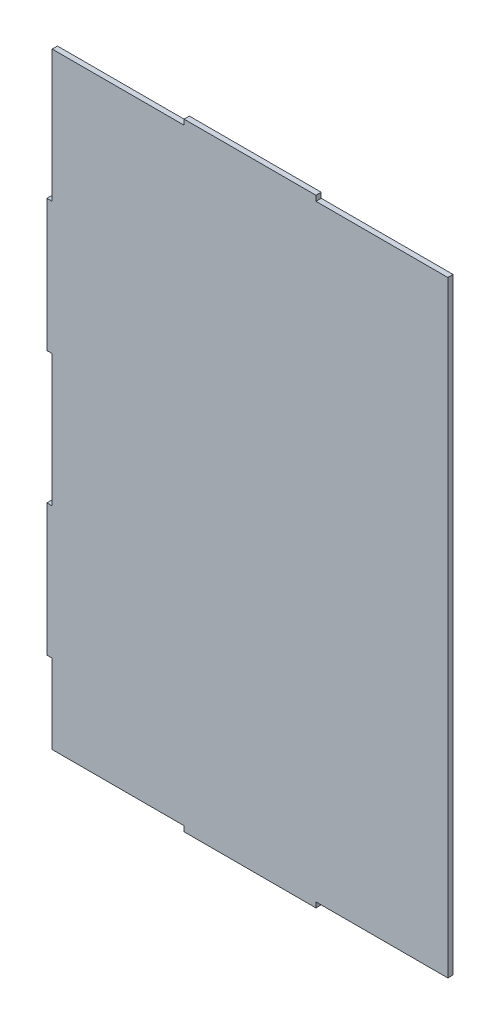
ISO-10303-21;
HEADER;
FILE_DESCRIPTION(('STEP AP214'),'2;1');
FILE_NAME('part.step','',(''),(''),'','','');
FILE_SCHEMA(('AUTOMOTIVE_DESIGN { 1 0 10303 214 1 1 1 1 }'));
ENDSEC;
DATA;
#1=APPLICATION_CONTEXT('core data for automotive mechanical design processes');
#2=APPLICATION_PROTOCOL_DEFINITION('international standard','automotive_design',2000,#1);
#3=PRODUCT_CONTEXT('',#1,'mechanical');
#4=PRODUCT('Part','Part','',(#3));
#5=PRODUCT_RELATED_PRODUCT_CATEGORY('part','',(#4));
#6=PRODUCT_DEFINITION_FORMATION('','',#4);
#7=PRODUCT_DEFINITION_CONTEXT('part definition',#1,'design');
#8=PRODUCT_DEFINITION('design','',#6,#7);
#9=PRODUCT_DEFINITION_SHAPE('','',#8);
#10=(LENGTH_UNIT() NAMED_UNIT(*) SI_UNIT(.MILLI.,.METRE.));
#11=(NAMED_UNIT(*) PLANE_ANGLE_UNIT() SI_UNIT($,.RADIAN.));
#12=(NAMED_UNIT(*) SI_UNIT($,.STERADIAN.) SOLID_ANGLE_UNIT());
#13=UNCERTAINTY_MEASURE_WITH_UNIT(LENGTH_MEASURE(1.E-05),#10,'distance_accuracy_value','');
#14=(GEOMETRIC_REPRESENTATION_CONTEXT(3) GLOBAL_UNCERTAINTY_ASSIGNED_CONTEXT((#13)) GLOBAL_UNIT_ASSIGNED_CONTEXT((#10,
#11,#12)) REPRESENTATION_CONTEXT('',''));
#15=CARTESIAN_POINT('',(0.,0.,0.));
#16=DIRECTION('',(0.,0.,1.));
#17=DIRECTION('',(1.,0.,0.));
#18=AXIS2_PLACEMENT_3D('',#15,#16,#17);
#19=CARTESIAN_POINT('',(-151.999999999999,-70.,4.));
#20=DIRECTION('',(1.,0.,0.));
#21=DIRECTION('',(0.,0.,-1.));
#22=AXIS2_PLACEMENT_3D('',#19,#20,#21);
#23=PLANE('',#22);
#24=DIRECTION('',(0.,-1.,0.));
#25=VECTOR('',#24,1.);
#26=CARTESIAN_POINT('',(-151.999999999999,-70.,0.));
#27=LINE('',#26,#25);
#28=CARTESIAN_POINT('',(-151.999999999999,-70.,0.));
#29=VERTEX_POINT('',#28);
#30=CARTESIAN_POINT('',(-151.999999999999,-170.,0.));
#31=VERTEX_POINT('',#30);
#32=EDGE_CURVE('E203',#29,#31,#27,.T.);
#33=ORIENTED_EDGE('',*,*,#32,.T.);
#34=DIRECTION('',(0.,0.,-1.));
#35=VECTOR('',#34,1.);
#36=CARTESIAN_POINT('',(-151.999999999999,-170.,4.));
#37=LINE('',#36,#35);
#38=CARTESIAN_POINT('',(-151.999999999999,-170.,4.));
#39=VERTEX_POINT('',#38);
#40=EDGE_CURVE('E11',#39,#31,#37,.T.);
#41=ORIENTED_EDGE('',*,*,#40,.F.);
#42=DIRECTION('',(0.,-1.,0.));
#43=VECTOR('',#42,1.);
#44=CARTESIAN_POINT('',(-151.999999999999,-70.,4.));
#45=LINE('',#44,#43);
#46=CARTESIAN_POINT('',(-151.999999999999,-70.,4.));
#47=VERTEX_POINT('',#46);
#48=EDGE_CURVE('E242',#47,#39,#45,.T.);
#49=ORIENTED_EDGE('',*,*,#48,.F.);
#50=DIRECTION('',(0.,0.,-1.));
#51=VECTOR('',#50,1.);
#52=CARTESIAN_POINT('',(-151.999999999999,-70.,4.));
#53=LINE('',#52,#51);
#54=EDGE_CURVE('E199',#47,#29,#53,.T.);
#55=ORIENTED_EDGE('',*,*,#54,.T.);
#56=EDGE_LOOP('',(#33,#41,#49,#55));
#57=FACE_BOUND('',#56,.T.);
#58=ADVANCED_FACE('F35',(#57),#23,.F.);
#59=CARTESIAN_POINT('',(-151.999999999999,-170.,4.));
#60=DIRECTION('',(0.,1.,0.));
#61=DIRECTION('',(0.,0.,1.));
#62=AXIS2_PLACEMENT_3D('',#59,#60,#61);
#63=PLANE('',#62);
#64=DIRECTION('',(1.,0.,0.));
#65=VECTOR('',#64,1.);
#66=CARTESIAN_POINT('',(-151.999999999999,-170.,0.));
#67=LINE('',#66,#65);
#68=CARTESIAN_POINT('',(-147.999999999999,-170.,0.));
#69=VERTEX_POINT('',#68);
#70=EDGE_CURVE('E206',#31,#69,#67,.T.);
#71=ORIENTED_EDGE('',*,*,#70,.T.);
#72=DIRECTION('',(0.,0.,-1.));
#73=VECTOR('',#72,1.);
#74=CARTESIAN_POINT('',(-147.999999999999,-170.,4.));
#75=LINE('',#74,#73);
#76=CARTESIAN_POINT('',(-147.999999999999,-170.,4.));
#77=VERTEX_POINT('',#76);
#78=EDGE_CURVE('E43',#77,#69,#75,.T.);
#79=ORIENTED_EDGE('',*,*,#78,.F.);
#80=DIRECTION('',(1.,0.,0.));
#81=VECTOR('',#80,1.);
#82=CARTESIAN_POINT('',(-151.999999999999,-170.,4.));
#83=LINE('',#82,#81);
#84=EDGE_CURVE('E130',#39,#77,#83,.T.);
#85=ORIENTED_EDGE('',*,*,#84,.F.);
#86=ORIENTED_EDGE('',*,*,#40,.T.);
#87=EDGE_LOOP('',(#71,#79,#85,#86));
#88=FACE_BOUND('',#87,.T.);
#89=ADVANCED_FACE('F360',(#88),#63,.F.);
#90=CARTESIAN_POINT('',(-147.999999999999,-170.,4.));
#91=DIRECTION('',(1.,0.,0.));
#92=DIRECTION('',(0.,1.,0.));
#93=AXIS2_PLACEMENT_3D('',#90,#91,#92);
#94=PLANE('',#93);
#95=DIRECTION('',(0.,-1.,0.));
#96=VECTOR('',#95,1.);
#97=CARTESIAN_POINT('',(-147.999999999999,-170.,0.));
#98=LINE('',#97,#96);
#99=CARTESIAN_POINT('',(-148.000000000001,-230.,0.));
#100=VERTEX_POINT('',#99);
#101=EDGE_CURVE('E208',#69,#100,#98,.T.);
#102=ORIENTED_EDGE('',*,*,#101,.T.);
#103=DIRECTION('',(0.,0.,-1.));
#104=VECTOR('',#103,1.);
#105=CARTESIAN_POINT('',(-148.000000000001,-230.,4.));
#106=LINE('',#105,#104);
#107=CARTESIAN_POINT('',(-148.000000000001,-230.,4.));
#108=VERTEX_POINT('',#107);
#109=EDGE_CURVE('E285',#108,#100,#106,.T.);
#110=ORIENTED_EDGE('',*,*,#109,.F.);
#111=DIRECTION('',(0.,-1.,0.));
#112=VECTOR('',#111,1.);
#113=CARTESIAN_POINT('',(-147.999999999999,-170.,4.));
#114=LINE('',#113,#112);
#115=EDGE_CURVE('E293',#77,#108,#114,.T.);
#116=ORIENTED_EDGE('',*,*,#115,.F.);
#117=ORIENTED_EDGE('',*,*,#78,.T.);
#118=EDGE_LOOP('',(#102,#110,#116,#117));
#119=FACE_BOUND('',#118,.T.);
#120=ADVANCED_FACE('F291',(#119),#94,.F.);
#121=CARTESIAN_POINT('',(-148.000000000001,-230.,4.));
#122=DIRECTION('',(0.,1.,0.));
#123=DIRECTION('',(0.,0.,1.));
#124=AXIS2_PLACEMENT_3D('',#121,#122,#123);
#125=PLANE('',#124);
#126=DIRECTION('',(1.,0.,0.));
#127=VECTOR('',#126,1.);
#128=CARTESIAN_POINT('',(-148.000000000001,-230.,0.));
#129=LINE('',#128,#127);
#130=CARTESIAN_POINT('',(-48.0000000000007,-230.,0.));
#131=VERTEX_POINT('',#130);
#132=EDGE_CURVE('E210',#100,#131,#129,.T.);
#133=ORIENTED_EDGE('',*,*,#132,.T.);
#134=DIRECTION('',(0.,0.,-1.));
#135=VECTOR('',#134,1.);
#136=CARTESIAN_POINT('',(-48.0000000000007,-230.,4.));
#137=LINE('',#136,#135);
#138=CARTESIAN_POINT('',(-48.0000000000007,-230.,4.));
#139=VERTEX_POINT('',#138);
#140=EDGE_CURVE('E282',#139,#131,#137,.T.);
#141=ORIENTED_EDGE('',*,*,#140,.F.);
#142=DIRECTION('',(1.,0.,0.));
#143=VECTOR('',#142,1.);
#144=CARTESIAN_POINT('',(-148.000000000001,-230.,4.));
#145=LINE('',#144,#143);
#146=EDGE_CURVE('E311',#108,#139,#145,.T.);
#147=ORIENTED_EDGE('',*,*,#146,.F.);
#148=ORIENTED_EDGE('',*,*,#109,.T.);
#149=EDGE_LOOP('',(#133,#141,#147,#148));
#150=FACE_BOUND('',#149,.T.);
#151=ADVANCED_FACE('F302',(#150),#125,.F.);
#152=CARTESIAN_POINT('',(-48.0000000000007,-230.,4.));
#153=DIRECTION('',(1.,0.,0.));
#154=DIRECTION('',(0.,0.,-1.));
#155=AXIS2_PLACEMENT_3D('',#152,#153,#154);
#156=PLANE('',#155);
#157=DIRECTION('',(0.,-1.,0.));
#158=VECTOR('',#157,1.);
#159=CARTESIAN_POINT('',(-48.0000000000007,-230.,0.));
#160=LINE('',#159,#158);
#161=CARTESIAN_POINT('',(-48.0000000000007,-234.,0.));
#162=VERTEX_POINT('',#161);
#163=EDGE_CURVE('E212',#131,#162,#160,.T.);
#164=ORIENTED_EDGE('',*,*,#163,.T.);
#165=DIRECTION('',(0.,0.,-1.));
#166=VECTOR('',#165,1.);
#167=CARTESIAN_POINT('',(-48.0000000000007,-234.,4.));
#168=LINE('',#167,#166);
#169=CARTESIAN_POINT('',(-48.0000000000007,-234.,4.));
#170=VERTEX_POINT('',#169);
#171=EDGE_CURVE('E279',#170,#162,#168,.T.);
#172=ORIENTED_EDGE('',*,*,#171,.F.);
#173=DIRECTION('',(0.,-1.,0.));
#174=VECTOR('',#173,1.);
#175=CARTESIAN_POINT('',(-48.0000000000007,-230.,4.));
#176=LINE('',#175,#174);
#177=EDGE_CURVE('E308',#139,#170,#176,.T.);
#178=ORIENTED_EDGE('',*,*,#177,.F.);
#179=ORIENTED_EDGE('',*,*,#140,.T.);
#180=EDGE_LOOP('',(#164,#172,#178,#179));
#181=FACE_BOUND('',#180,.T.);
#182=ADVANCED_FACE('F306',(#181),#156,.F.);
#183=CARTESIAN_POINT('',(-48.0000000000007,-234.,4.));
#184=DIRECTION('',(0.,1.,0.));
#185=DIRECTION('',(0.,0.,1.));
#186=AXIS2_PLACEMENT_3D('',#183,#184,#185);
#187=PLANE('',#186);
#188=DIRECTION('',(1.,0.,0.));
#189=VECTOR('',#188,1.);
#190=CARTESIAN_POINT('',(-48.0000000000007,-234.,0.));
#191=LINE('',#190,#189);
#192=CARTESIAN_POINT('',(51.9999999999993,-234.,0.));
#193=VERTEX_POINT('',#192);
#194=EDGE_CURVE('E214',#162,#193,#191,.T.);
#195=ORIENTED_EDGE('',*,*,#194,.T.);
#196=DIRECTION('',(0.,0.,-1.));
#197=VECTOR('',#196,1.);
#198=CARTESIAN_POINT('',(51.9999999999993,-234.,4.));
#199=LINE('',#198,#197);
#200=CARTESIAN_POINT('',(51.9999999999993,-234.,4.));
#201=VERTEX_POINT('',#200);
#202=EDGE_CURVE('E276',#201,#193,#199,.T.);
#203=ORIENTED_EDGE('',*,*,#202,.F.);
#204=DIRECTION('',(1.,0.,0.));
#205=VECTOR('',#204,1.);
#206=CARTESIAN_POINT('',(-48.0000000000007,-234.,4.));
#207=LINE('',#206,#205);
#208=EDGE_CURVE('E310',#170,#201,#207,.T.);
#209=ORIENTED_EDGE('',*,*,#208,.F.);
#210=ORIENTED_EDGE('',*,*,#171,.T.);
#211=EDGE_LOOP('',(#195,#203,#209,#210));
#212=FACE_BOUND('',#211,.T.);
#213=ADVANCED_FACE('F373',(#212),#187,.F.);
#214=CARTESIAN_POINT('',(51.9999999999993,-234.,4.));
#215=DIRECTION('',(-1.,0.,0.));
#216=DIRECTION('',(0.,0.,1.));
#217=AXIS2_PLACEMENT_3D('',#214,#215,#216);
#218=PLANE('',#217);
#219=DIRECTION('',(0.,1.,0.));
#220=VECTOR('',#219,1.);
#221=CARTESIAN_POINT('',(51.9999999999993,-234.,0.));
#222=LINE('',#221,#220);
#223=CARTESIAN_POINT('',(51.9999999999993,-230.,0.));
#224=VERTEX_POINT('',#223);
#225=EDGE_CURVE('E216',#193,#224,#222,.T.);
#226=ORIENTED_EDGE('',*,*,#225,.T.);
#227=DIRECTION('',(0.,0.,-1.));
#228=VECTOR('',#227,1.);
#229=CARTESIAN_POINT('',(51.9999999999993,-230.,4.));
#230=LINE('',#229,#228);
#231=CARTESIAN_POINT('',(51.9999999999993,-230.,4.));
#232=VERTEX_POINT('',#231);
#233=EDGE_CURVE('E273',#232,#224,#230,.T.);
#234=ORIENTED_EDGE('',*,*,#233,.F.);
#235=DIRECTION('',(0.,1.,0.));
#236=VECTOR('',#235,1.);
#237=CARTESIAN_POINT('',(51.9999999999993,-234.,4.));
#238=LINE('',#237,#236);
#239=EDGE_CURVE('E313',#201,#232,#238,.T.);
#240=ORIENTED_EDGE('',*,*,#239,.F.);
#241=ORIENTED_EDGE('',*,*,#202,.T.);
#242=EDGE_LOOP('',(#226,#234,#240,#241));
#243=FACE_BOUND('',#242,.T.);
#244=ADVANCED_FACE('F376',(#243),#218,.F.);
#245=CARTESIAN_POINT('',(51.9999999999993,-230.,4.));
#246=DIRECTION('',(0.,1.,0.));
#247=DIRECTION('',(0.,0.,1.));
#248=AXIS2_PLACEMENT_3D('',#245,#246,#247);
#249=PLANE('',#248);
#250=DIRECTION('',(1.,0.,0.));
#251=VECTOR('',#250,1.);
#252=CARTESIAN_POINT('',(51.9999999999993,-230.,0.));
#253=LINE('',#252,#251);
#254=CARTESIAN_POINT('',(151.999999999999,-230.,0.));
#255=VERTEX_POINT('',#254);
#256=EDGE_CURVE('E218',#224,#255,#253,.T.);
#257=ORIENTED_EDGE('',*,*,#256,.T.);
#258=DIRECTION('',(0.,0.,-1.));
#259=VECTOR('',#258,1.);
#260=CARTESIAN_POINT('',(151.999999999999,-230.,4.));
#261=LINE('',#260,#259);
#262=CARTESIAN_POINT('',(151.999999999999,-230.,4.));
#263=VERTEX_POINT('',#262);
#264=EDGE_CURVE('E270',#263,#255,#261,.T.);
#265=ORIENTED_EDGE('',*,*,#264,.F.);
#266=DIRECTION('',(1.,0.,0.));
#267=VECTOR('',#266,1.);
#268=CARTESIAN_POINT('',(51.9999999999993,-230.,4.));
#269=LINE('',#268,#267);
#270=EDGE_CURVE('E319',#232,#263,#269,.T.);
#271=ORIENTED_EDGE('',*,*,#270,.F.);
#272=ORIENTED_EDGE('',*,*,#233,.T.);
#273=EDGE_LOOP('',(#257,#265,#271,#272));
#274=FACE_BOUND('',#273,.T.);
#275=ADVANCED_FACE('F380',(#274),#249,.F.);
#276=CARTESIAN_POINT('',(151.999999999999,130.,4.));
#277=DIRECTION('',(-1.,0.,0.));
#278=DIRECTION('',(0.,0.,1.));
#279=AXIS2_PLACEMENT_3D('',#276,#277,#278);
#280=PLANE('',#279);
#281=DIRECTION('',(0.,1.,0.));
#282=VECTOR('',#281,1.);
#283=CARTESIAN_POINT('',(151.999999999999,130.,0.));
#284=LINE('',#283,#282);
#285=CARTESIAN_POINT('',(151.999999999999,230.,0.));
#286=VERTEX_POINT('',#285);
#287=EDGE_CURVE('E221',#255,#286,#284,.T.);
#288=ORIENTED_EDGE('',*,*,#287,.T.);
#289=DIRECTION('',(0.,0.,-1.));
#290=VECTOR('',#289,1.);
#291=CARTESIAN_POINT('',(151.999999999999,230.,4.));
#292=LINE('',#291,#290);
#293=CARTESIAN_POINT('',(151.999999999999,230.,4.));
#294=VERTEX_POINT('',#293);
#295=EDGE_CURVE('E267',#294,#286,#292,.T.);
#296=ORIENTED_EDGE('',*,*,#295,.F.);
#297=DIRECTION('',(0.,1.,0.));
#298=VECTOR('',#297,1.);
#299=CARTESIAN_POINT('',(151.999999999999,-230.,4.));
#300=LINE('',#299,#298);
#301=EDGE_CURVE('E321',#263,#294,#300,.T.);
#302=ORIENTED_EDGE('',*,*,#301,.F.);
#303=ORIENTED_EDGE('',*,*,#264,.T.);
#304=EDGE_LOOP('',(#288,#296,#302,#303));
#305=FACE_BOUND('',#304,.T.);
#306=ADVANCED_FACE('F384',(#305),#280,.F.);
#307=CARTESIAN_POINT('',(151.999999999999,230.,4.));
#308=DIRECTION('',(0.,-1.,0.));
#309=DIRECTION('',(0.,0.,-1.));
#310=AXIS2_PLACEMENT_3D('',#307,#308,#309);
#311=PLANE('',#310);
#312=DIRECTION('',(-1.,0.,0.));
#313=VECTOR('',#312,1.);
#314=CARTESIAN_POINT('',(151.999999999999,230.,0.));
#315=LINE('',#314,#313);
#316=CARTESIAN_POINT('',(51.9999999999993,230.,0.));
#317=VERTEX_POINT('',#316);
#318=EDGE_CURVE('E223',#286,#317,#315,.T.);
#319=ORIENTED_EDGE('',*,*,#318,.T.);
#320=DIRECTION('',(0.,0.,-1.));
#321=VECTOR('',#320,1.);
#322=CARTESIAN_POINT('',(51.9999999999993,230.,4.));
#323=LINE('',#322,#321);
#324=CARTESIAN_POINT('',(51.9999999999993,230.,4.));
#325=VERTEX_POINT('',#324);
#326=EDGE_CURVE('E264',#325,#317,#323,.T.);
#327=ORIENTED_EDGE('',*,*,#326,.F.);
#328=DIRECTION('',(-1.,0.,0.));
#329=VECTOR('',#328,1.);
#330=CARTESIAN_POINT('',(151.999999999999,230.,4.));
#331=LINE('',#330,#329);
#332=EDGE_CURVE('E323',#294,#325,#331,.T.);
#333=ORIENTED_EDGE('',*,*,#332,.F.);
#334=ORIENTED_EDGE('',*,*,#295,.T.);
#335=EDGE_LOOP('',(#319,#327,#333,#334));
#336=FACE_BOUND('',#335,.T.);
#337=ADVANCED_FACE('F388',(#336),#311,.F.);
#338=CARTESIAN_POINT('',(51.9999999999993,234.,4.));
#339=DIRECTION('',(-1.,0.,0.));
#340=DIRECTION('',(0.,0.,1.));
#341=AXIS2_PLACEMENT_3D('',#338,#339,#340);
#342=PLANE('',#341);
#343=DIRECTION('',(0.,1.,0.));
#344=VECTOR('',#343,1.);
#345=CARTESIAN_POINT('',(51.9999999999993,234.,0.));
#346=LINE('',#345,#344);
#347=CARTESIAN_POINT('',(51.9999999999993,234.,0.));
#348=VERTEX_POINT('',#347);
#349=EDGE_CURVE('E225',#317,#348,#346,.T.);
#350=ORIENTED_EDGE('',*,*,#349,.T.);
#351=DIRECTION('',(0.,0.,-1.));
#352=VECTOR('',#351,1.);
#353=CARTESIAN_POINT('',(51.9999999999993,234.,4.));
#354=LINE('',#353,#352);
#355=CARTESIAN_POINT('',(51.9999999999993,234.,4.));
#356=VERTEX_POINT('',#355);
#357=EDGE_CURVE('E261',#356,#348,#354,.T.);
#358=ORIENTED_EDGE('',*,*,#357,.F.);
#359=DIRECTION('',(0.,1.,0.));
#360=VECTOR('',#359,1.);
#361=CARTESIAN_POINT('',(51.9999999999993,234.,4.));
#362=LINE('',#361,#360);
#363=EDGE_CURVE('E325',#325,#356,#362,.T.);
#364=ORIENTED_EDGE('',*,*,#363,.F.);
#365=ORIENTED_EDGE('',*,*,#326,.T.);
#366=EDGE_LOOP('',(#350,#358,#364,#365));
#367=FACE_BOUND('',#366,.T.);
#368=ADVANCED_FACE('F392',(#367),#342,.F.);
#369=CARTESIAN_POINT('',(-48.0000000000007,234.,4.));
#370=DIRECTION('',(0.,-1.,0.));
#371=DIRECTION('',(0.,0.,-1.));
#372=AXIS2_PLACEMENT_3D('',#369,#370,#371);
#373=PLANE('',#372);
#374=DIRECTION('',(-1.,0.,0.));
#375=VECTOR('',#374,1.);
#376=CARTESIAN_POINT('',(-48.0000000000007,234.,0.));
#377=LINE('',#376,#375);
#378=CARTESIAN_POINT('',(-48.0000000000007,234.,0.));
#379=VERTEX_POINT('',#378);
#380=EDGE_CURVE('E227',#348,#379,#377,.T.);
#381=ORIENTED_EDGE('',*,*,#380,.T.);
#382=DIRECTION('',(0.,0.,-1.));
#383=VECTOR('',#382,1.);
#384=CARTESIAN_POINT('',(-48.0000000000007,234.,4.));
#385=LINE('',#384,#383);
#386=CARTESIAN_POINT('',(-48.0000000000007,234.,4.));
#387=VERTEX_POINT('',#386);
#388=EDGE_CURVE('E258',#387,#379,#385,.T.);
#389=ORIENTED_EDGE('',*,*,#388,.F.);
#390=DIRECTION('',(-1.,0.,0.));
#391=VECTOR('',#390,1.);
#392=CARTESIAN_POINT('',(-48.0000000000007,234.,4.));
#393=LINE('',#392,#391);
#394=EDGE_CURVE('E327',#356,#387,#393,.T.);
#395=ORIENTED_EDGE('',*,*,#394,.F.);
#396=ORIENTED_EDGE('',*,*,#357,.T.);
#397=EDGE_LOOP('',(#381,#389,#395,#396));
#398=FACE_BOUND('',#397,.T.);
#399=ADVANCED_FACE('F396',(#398),#373,.F.);
#400=CARTESIAN_POINT('',(-48.0000000000007,230.,4.));
#401=DIRECTION('',(1.,0.,0.));
#402=DIRECTION('',(0.,0.,-1.));
#403=AXIS2_PLACEMENT_3D('',#400,#401,#402);
#404=PLANE('',#403);
#405=DIRECTION('',(0.,-1.,0.));
#406=VECTOR('',#405,1.);
#407=CARTESIAN_POINT('',(-48.0000000000007,230.,0.));
#408=LINE('',#407,#406);
#409=CARTESIAN_POINT('',(-48.0000000000007,230.,0.));
#410=VERTEX_POINT('',#409);
#411=EDGE_CURVE('E229',#379,#410,#408,.T.);
#412=ORIENTED_EDGE('',*,*,#411,.T.);
#413=DIRECTION('',(0.,0.,-1.));
#414=VECTOR('',#413,1.);
#415=CARTESIAN_POINT('',(-48.0000000000007,230.,4.));
#416=LINE('',#415,#414);
#417=CARTESIAN_POINT('',(-48.0000000000007,230.,4.));
#418=VERTEX_POINT('',#417);
#419=EDGE_CURVE('E255',#418,#410,#416,.T.);
#420=ORIENTED_EDGE('',*,*,#419,.F.);
#421=DIRECTION('',(0.,-1.,0.));
#422=VECTOR('',#421,1.);
#423=CARTESIAN_POINT('',(-48.0000000000007,230.,4.));
#424=LINE('',#423,#422);
#425=EDGE_CURVE('E329',#387,#418,#424,.T.);
#426=ORIENTED_EDGE('',*,*,#425,.F.);
#427=ORIENTED_EDGE('',*,*,#388,.T.);
#428=EDGE_LOOP('',(#412,#420,#426,#427));
#429=FACE_BOUND('',#428,.T.);
#430=ADVANCED_FACE('F400',(#429),#404,.F.);
#431=CARTESIAN_POINT('',(-48.0000000000007,230.,4.));
#432=DIRECTION('',(0.,-1.,0.));
#433=DIRECTION('',(0.,0.,-1.));
#434=AXIS2_PLACEMENT_3D('',#431,#432,#433);
#435=PLANE('',#434);
#436=DIRECTION('',(-1.,0.,0.));
#437=VECTOR('',#436,1.);
#438=CARTESIAN_POINT('',(-48.0000000000007,230.,0.));
#439=LINE('',#438,#437);
#440=CARTESIAN_POINT('',(-148.000000000001,230.,0.));
#441=VERTEX_POINT('',#440);
#442=EDGE_CURVE('E231',#410,#441,#439,.T.);
#443=ORIENTED_EDGE('',*,*,#442,.T.);
#444=DIRECTION('',(0.,0.,-1.));
#445=VECTOR('',#444,1.);
#446=CARTESIAN_POINT('',(-148.000000000001,230.,4.));
#447=LINE('',#446,#445);
#448=CARTESIAN_POINT('',(-148.000000000001,230.,4.));
#449=VERTEX_POINT('',#448);
#450=EDGE_CURVE('E252',#449,#441,#447,.T.);
#451=ORIENTED_EDGE('',*,*,#450,.F.);
#452=DIRECTION('',(-1.,0.,0.));
#453=VECTOR('',#452,1.);
#454=CARTESIAN_POINT('',(-48.0000000000007,230.,4.));
#455=LINE('',#454,#453);
#456=EDGE_CURVE('E331',#418,#449,#455,.T.);
#457=ORIENTED_EDGE('',*,*,#456,.F.);
#458=ORIENTED_EDGE('',*,*,#419,.T.);
#459=EDGE_LOOP('',(#443,#451,#457,#458));
#460=FACE_BOUND('',#459,.T.);
#461=ADVANCED_FACE('F404',(#460),#435,.F.);
#462=CARTESIAN_POINT('',(-148.000000000001,230.,4.));
#463=DIRECTION('',(1.,0.,0.));
#464=DIRECTION('',(0.,1.,0.));
#465=AXIS2_PLACEMENT_3D('',#462,#463,#464);
#466=PLANE('',#465);
#467=DIRECTION('',(0.,-1.,0.));
#468=VECTOR('',#467,1.);
#469=CARTESIAN_POINT('',(-148.000000000001,230.,0.));
#470=LINE('',#469,#468);
#471=CARTESIAN_POINT('',(-148.,130.,0.));
#472=VERTEX_POINT('',#471);
#473=EDGE_CURVE('E233',#441,#472,#470,.T.);
#474=ORIENTED_EDGE('',*,*,#473,.T.);
#475=DIRECTION('',(0.,0.,-1.));
#476=VECTOR('',#475,1.);
#477=CARTESIAN_POINT('',(-148.,130.,4.));
#478=LINE('',#477,#476);
#479=CARTESIAN_POINT('',(-148.,130.,4.));
#480=VERTEX_POINT('',#479);
#481=EDGE_CURVE('E249',#480,#472,#478,.T.);
#482=ORIENTED_EDGE('',*,*,#481,.F.);
#483=DIRECTION('',(0.,-1.,0.));
#484=VECTOR('',#483,1.);
#485=CARTESIAN_POINT('',(-148.000000000001,230.,4.));
#486=LINE('',#485,#484);
#487=EDGE_CURVE('E333',#449,#480,#486,.T.);
#488=ORIENTED_EDGE('',*,*,#487,.F.);
#489=ORIENTED_EDGE('',*,*,#450,.T.);
#490=EDGE_LOOP('',(#474,#482,#488,#489));
#491=FACE_BOUND('',#490,.T.);
#492=ADVANCED_FACE('F408',(#491),#466,.F.);
#493=CARTESIAN_POINT('',(-148.,130.,4.));
#494=DIRECTION('',(0.,-1.,0.));
#495=DIRECTION('',(0.,0.,-1.));
#496=AXIS2_PLACEMENT_3D('',#493,#494,#495);
#497=PLANE('',#496);
#498=DIRECTION('',(-1.,0.,0.));
#499=VECTOR('',#498,1.);
#500=CARTESIAN_POINT('',(-148.,130.,0.));
#501=LINE('',#500,#499);
#502=CARTESIAN_POINT('',(-152.,130.,0.));
#503=VERTEX_POINT('',#502);
#504=EDGE_CURVE('E235',#472,#503,#501,.T.);
#505=ORIENTED_EDGE('',*,*,#504,.T.);
#506=DIRECTION('',(0.,0.,-1.));
#507=VECTOR('',#506,1.);
#508=CARTESIAN_POINT('',(-152.,130.,4.));
#509=LINE('',#508,#507);
#510=CARTESIAN_POINT('',(-152.,130.,4.));
#511=VERTEX_POINT('',#510);
#512=EDGE_CURVE('E246',#511,#503,#509,.T.);
#513=ORIENTED_EDGE('',*,*,#512,.F.);
#514=DIRECTION('',(-1.,0.,0.));
#515=VECTOR('',#514,1.);
#516=CARTESIAN_POINT('',(-148.,130.,4.));
#517=LINE('',#516,#515);
#518=EDGE_CURVE('E335',#480,#511,#517,.T.);
#519=ORIENTED_EDGE('',*,*,#518,.F.);
#520=ORIENTED_EDGE('',*,*,#481,.T.);
#521=EDGE_LOOP('',(#505,#513,#519,#520));
#522=FACE_BOUND('',#521,.T.);
#523=ADVANCED_FACE('F341',(#522),#497,.F.);
#524=CARTESIAN_POINT('',(-152.,130.,4.));
#525=DIRECTION('',(1.,0.,0.));
#526=DIRECTION('',(0.,1.,0.));
#527=AXIS2_PLACEMENT_3D('',#524,#525,#526);
#528=PLANE('',#527);
#529=DIRECTION('',(0.,-1.,0.));
#530=VECTOR('',#529,1.);
#531=CARTESIAN_POINT('',(-152.,130.,0.));
#532=LINE('',#531,#530);
#533=CARTESIAN_POINT('',(-152.,30.,0.));
#534=VERTEX_POINT('',#533);
#535=EDGE_CURVE('E237',#503,#534,#532,.T.);
#536=ORIENTED_EDGE('',*,*,#535,.T.);
#537=DIRECTION('',(0.,0.,-1.));
#538=VECTOR('',#537,1.);
#539=CARTESIAN_POINT('',(-152.,30.,4.));
#540=LINE('',#539,#538);
#541=CARTESIAN_POINT('',(-152.,30.,4.));
#542=VERTEX_POINT('',#541);
#543=EDGE_CURVE('E194',#542,#534,#540,.T.);
#544=ORIENTED_EDGE('',*,*,#543,.F.);
#545=DIRECTION('',(0.,-1.,0.));
#546=VECTOR('',#545,1.);
#547=CARTESIAN_POINT('',(-152.,130.,4.));
#548=LINE('',#547,#546);
#549=EDGE_CURVE('E185',#511,#542,#548,.T.);
#550=ORIENTED_EDGE('',*,*,#549,.F.);
#551=ORIENTED_EDGE('',*,*,#512,.T.);
#552=EDGE_LOOP('',(#536,#544,#550,#551));
#553=FACE_BOUND('',#552,.T.);
#554=ADVANCED_FACE('F345',(#553),#528,.F.);
#555=CARTESIAN_POINT('',(-152.,30.,4.));
#556=DIRECTION('',(0.,1.,0.));
#557=DIRECTION('',(0.,0.,1.));
#558=AXIS2_PLACEMENT_3D('',#555,#556,#557);
#559=PLANE('',#558);
#560=DIRECTION('',(1.,0.,0.));
#561=VECTOR('',#560,1.);
#562=CARTESIAN_POINT('',(-152.,30.,0.));
#563=LINE('',#562,#561);
#564=CARTESIAN_POINT('',(-148.,30.,0.));
#565=VERTEX_POINT('',#564);
#566=EDGE_CURVE('E193',#534,#565,#563,.T.);
#567=ORIENTED_EDGE('',*,*,#566,.T.);
#568=DIRECTION('',(0.,0.,-1.));
#569=VECTOR('',#568,1.);
#570=CARTESIAN_POINT('',(-148.,30.,4.));
#571=LINE('',#570,#569);
#572=CARTESIAN_POINT('',(-148.,30.,4.));
#573=VERTEX_POINT('',#572);
#574=EDGE_CURVE('E190',#573,#565,#571,.T.);
#575=ORIENTED_EDGE('',*,*,#574,.F.);
#576=DIRECTION('',(1.,0.,0.));
#577=VECTOR('',#576,1.);
#578=CARTESIAN_POINT('',(-152.,30.,4.));
#579=LINE('',#578,#577);
#580=EDGE_CURVE('E179',#542,#573,#579,.T.);
#581=ORIENTED_EDGE('',*,*,#580,.F.);
#582=ORIENTED_EDGE('',*,*,#543,.T.);
#583=EDGE_LOOP('',(#567,#575,#581,#582));
#584=FACE_BOUND('',#583,.T.);
#585=ADVANCED_FACE('F191',(#584),#559,.F.);
#586=CARTESIAN_POINT('',(-148.,30.,4.));
#587=DIRECTION('',(1.,0.,0.));
#588=DIRECTION('',(0.,1.,0.));
#589=AXIS2_PLACEMENT_3D('',#586,#587,#588);
#590=PLANE('',#589);
#591=DIRECTION('',(0.,-1.,0.));
#592=VECTOR('',#591,1.);
#593=CARTESIAN_POINT('',(-148.,30.,0.));
#594=LINE('',#593,#592);
#595=CARTESIAN_POINT('',(-147.999999999999,-70.,0.));
#596=VERTEX_POINT('',#595);
#597=EDGE_CURVE('E116',#565,#596,#594,.T.);
#598=ORIENTED_EDGE('',*,*,#597,.T.);
#599=DIRECTION('',(0.,0.,-1.));
#600=VECTOR('',#599,1.);
#601=CARTESIAN_POINT('',(-147.999999999999,-70.,4.));
#602=LINE('',#601,#600);
#603=CARTESIAN_POINT('',(-147.999999999999,-70.,4.));
#604=VERTEX_POINT('',#603);
#605=EDGE_CURVE('E195',#604,#596,#602,.T.);
#606=ORIENTED_EDGE('',*,*,#605,.F.);
#607=DIRECTION('',(0.,-1.,0.));
#608=VECTOR('',#607,1.);
#609=CARTESIAN_POINT('',(-148.,30.,4.));
#610=LINE('',#609,#608);
#611=EDGE_CURVE('E183',#573,#604,#610,.T.);
#612=ORIENTED_EDGE('',*,*,#611,.F.);
#613=ORIENTED_EDGE('',*,*,#574,.T.);
#614=EDGE_LOOP('',(#598,#606,#612,#613));
#615=FACE_BOUND('',#614,.T.);
#616=ADVANCED_FACE('F197',(#615),#590,.F.);
#617=CARTESIAN_POINT('',(-147.999999999999,-70.,4.));
#618=DIRECTION('',(0.,-1.,0.));
#619=DIRECTION('',(0.,0.,-1.));
#620=AXIS2_PLACEMENT_3D('',#617,#618,#619);
#621=PLANE('',#620);
#622=DIRECTION('',(-1.,0.,0.));
#623=VECTOR('',#622,1.);
#624=CARTESIAN_POINT('',(-147.999999999999,-70.,0.));
#625=LINE('',#624,#623);
#626=EDGE_CURVE('E122',#596,#29,#625,.T.);
#627=ORIENTED_EDGE('',*,*,#626,.T.);
#628=ORIENTED_EDGE('',*,*,#54,.F.);
#629=DIRECTION('',(-1.,0.,0.));
#630=VECTOR('',#629,1.);
#631=CARTESIAN_POINT('',(-147.999999999999,-70.,4.));
#632=LINE('',#631,#630);
#633=EDGE_CURVE('E51',#604,#47,#632,.T.);
#634=ORIENTED_EDGE('',*,*,#633,.F.);
#635=ORIENTED_EDGE('',*,*,#605,.T.);
#636=EDGE_LOOP('',(#627,#628,#634,#635));
#637=FACE_BOUND('',#636,.T.);
#638=ADVANCED_FACE('F349',(#637),#621,.F.);
#639=CARTESIAN_POINT('',(0.,0.,4.));
#640=DIRECTION('',(0.,0.,1.));
#641=DIRECTION('',(1.,0.,0.));
#642=AXIS2_PLACEMENT_3D('',#639,#640,#641);
#643=PLANE('',#642);
#644=ORIENTED_EDGE('',*,*,#48,.T.);
#645=ORIENTED_EDGE('',*,*,#84,.T.);
#646=ORIENTED_EDGE('',*,*,#115,.T.);
#647=ORIENTED_EDGE('',*,*,#146,.T.);
#648=ORIENTED_EDGE('',*,*,#177,.T.);
#649=ORIENTED_EDGE('',*,*,#208,.T.);
#650=ORIENTED_EDGE('',*,*,#239,.T.);
#651=ORIENTED_EDGE('',*,*,#270,.T.);
#652=ORIENTED_EDGE('',*,*,#301,.T.);
#653=ORIENTED_EDGE('',*,*,#332,.T.);
#654=ORIENTED_EDGE('',*,*,#363,.T.);
#655=ORIENTED_EDGE('',*,*,#394,.T.);
#656=ORIENTED_EDGE('',*,*,#425,.T.);
#657=ORIENTED_EDGE('',*,*,#456,.T.);
#658=ORIENTED_EDGE('',*,*,#487,.T.);
#659=ORIENTED_EDGE('',*,*,#518,.T.);
#660=ORIENTED_EDGE('',*,*,#549,.T.);
#661=ORIENTED_EDGE('',*,*,#580,.T.);
#662=ORIENTED_EDGE('',*,*,#611,.T.);
#663=ORIENTED_EDGE('',*,*,#633,.T.);
#664=EDGE_LOOP('',(#644,#645,#646,#647,#648,#649,#650,#651,#652,#653,#654,#655,#656,#657,#658,
#659,#660,#661,#662,#663));
#665=FACE_BOUND('',#664,.T.);
#666=ADVANCED_FACE('F181',(#665),#643,.T.);
#667=CARTESIAN_POINT('',(0.,0.,0.));
#668=DIRECTION('',(0.,0.,1.));
#669=DIRECTION('',(1.,0.,0.));
#670=AXIS2_PLACEMENT_3D('',#667,#668,#669);
#671=PLANE('',#670);
#672=ORIENTED_EDGE('',*,*,#32,.F.);
#673=ORIENTED_EDGE('',*,*,#626,.F.);
#674=ORIENTED_EDGE('',*,*,#597,.F.);
#675=ORIENTED_EDGE('',*,*,#566,.F.);
#676=ORIENTED_EDGE('',*,*,#535,.F.);
#677=ORIENTED_EDGE('',*,*,#504,.F.);
#678=ORIENTED_EDGE('',*,*,#473,.F.);
#679=ORIENTED_EDGE('',*,*,#442,.F.);
#680=ORIENTED_EDGE('',*,*,#411,.F.);
#681=ORIENTED_EDGE('',*,*,#380,.F.);
#682=ORIENTED_EDGE('',*,*,#349,.F.);
#683=ORIENTED_EDGE('',*,*,#318,.F.);
#684=ORIENTED_EDGE('',*,*,#287,.F.);
#685=ORIENTED_EDGE('',*,*,#256,.F.);
#686=ORIENTED_EDGE('',*,*,#225,.F.);
#687=ORIENTED_EDGE('',*,*,#194,.F.);
#688=ORIENTED_EDGE('',*,*,#163,.F.);
#689=ORIENTED_EDGE('',*,*,#132,.F.);
#690=ORIENTED_EDGE('',*,*,#101,.F.);
#691=ORIENTED_EDGE('',*,*,#70,.F.);
#692=EDGE_LOOP('',(#672,#673,#674,#675,#676,#677,#678,#679,#680,#681,#682,#683,#684,#685,#686,
#687,#688,#689,#690,#691));
#693=FACE_BOUND('',#692,.T.);
#694=ADVANCED_FACE('F297',(#693),#671,.F.);
#695=CLOSED_SHELL('',(#58,#89,#120,#151,#182,#213,#244,#275,#306,#337,#368,#399,#430,#461,#492,
#523,#554,#585,#616,#638,#666,#694));
#696=MANIFOLD_SOLID_BREP('B2',#695);
#697=ADVANCED_BREP_SHAPE_REPRESENTATION('',(#18,#696),#14);
#698=SHAPE_DEFINITION_REPRESENTATION(#9,#697);
ENDSEC;
END-ISO-10303-21;
